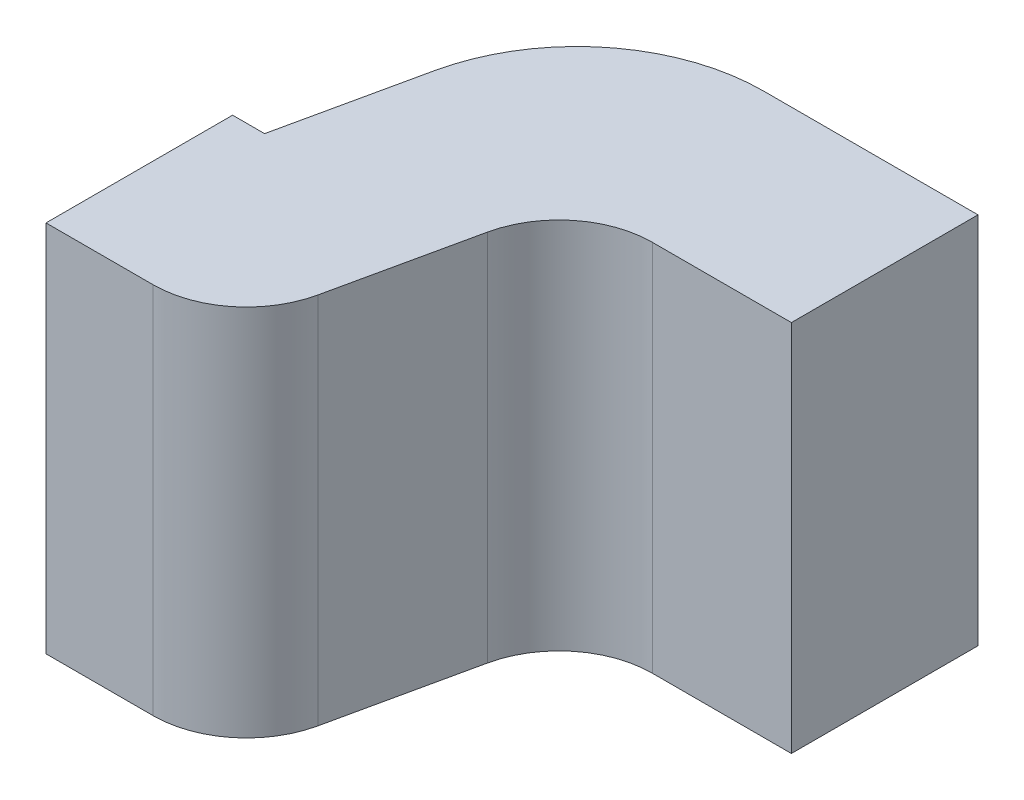
ISO-10303-21;
HEADER;
FILE_DESCRIPTION(('STEP AP214'),'2;1');
FILE_NAME('part.step','',(''),(''),'','','');
FILE_SCHEMA(('AUTOMOTIVE_DESIGN { 1 0 10303 214 1 1 1 1 }'));
ENDSEC;
DATA;
#1=APPLICATION_CONTEXT('core data for automotive mechanical design processes');
#2=APPLICATION_PROTOCOL_DEFINITION('international standard','automotive_design',2000,#1);
#3=PRODUCT_CONTEXT('',#1,'mechanical');
#4=PRODUCT('Part','Part','',(#3));
#5=PRODUCT_RELATED_PRODUCT_CATEGORY('part','',(#4));
#6=PRODUCT_DEFINITION_FORMATION('','',#4);
#7=PRODUCT_DEFINITION_CONTEXT('part definition',#1,'design');
#8=PRODUCT_DEFINITION('design','',#6,#7);
#9=PRODUCT_DEFINITION_SHAPE('','',#8);
#10=(LENGTH_UNIT() NAMED_UNIT(*) SI_UNIT(.MILLI.,.METRE.));
#11=(NAMED_UNIT(*) PLANE_ANGLE_UNIT() SI_UNIT($,.RADIAN.));
#12=(NAMED_UNIT(*) SI_UNIT($,.STERADIAN.) SOLID_ANGLE_UNIT());
#13=UNCERTAINTY_MEASURE_WITH_UNIT(LENGTH_MEASURE(1.E-05),#10,'distance_accuracy_value','');
#14=(GEOMETRIC_REPRESENTATION_CONTEXT(3) GLOBAL_UNCERTAINTY_ASSIGNED_CONTEXT((#13)) GLOBAL_UNIT_ASSIGNED_CONTEXT((#10,
#11,#12)) REPRESENTATION_CONTEXT('',''));
#15=CARTESIAN_POINT('',(0.,0.,0.));
#16=DIRECTION('',(0.,0.,1.));
#17=DIRECTION('',(1.,0.,0.));
#18=AXIS2_PLACEMENT_3D('',#15,#16,#17);
#19=CARTESIAN_POINT('',(0.76,-0.2175,0.));
#20=DIRECTION('',(0.,1.,0.));
#21=DIRECTION('',(0.,0.,1.));
#22=AXIS2_PLACEMENT_3D('',#19,#20,#21);
#23=PLANE('',#22);
#24=DIRECTION('',(1.,0.,0.));
#25=VECTOR('',#24,1.);
#26=CARTESIAN_POINT('',(0.76,-0.2175,0.2175));
#27=LINE('',#26,#25);
#28=CARTESIAN_POINT('',(1.02283563646,-0.2175,0.2175));
#29=VERTEX_POINT('',#28);
#30=CARTESIAN_POINT('',(1.185,-0.2175,0.2175));
#31=VERTEX_POINT('',#30);
#32=EDGE_CURVE('E134',#29,#31,#27,.T.);
#33=ORIENTED_EDGE('',*,*,#32,.F.);
#34=CARTESIAN_POINT('',(1.02283563646,-0.2175,0.32625));
#35=DIRECTION('',(0.,1.,0.));
#36=DIRECTION('',(0.,0.,1.));
#37=AXIS2_PLACEMENT_3D('',#34,#35,#36);
#38=CIRCLE('',#37,0.10875);
#39=CARTESIAN_POINT('',(0.916577211018419,-0.2175,0.303104600398974));
#40=VERTEX_POINT('',#39);
#41=EDGE_CURVE('E177',#29,#40,#38,.T.);
#42=ORIENTED_EDGE('',*,*,#41,.T.);
#43=DIRECTION('',(0.212831260699979,0.,-0.977088969576905));
#44=VECTOR('',#43,1.);
#45=CARTESIAN_POINT('',(0.972516850883,-0.2175,0.04629079920223));
#46=LINE('',#45,#44);
#47=CARTESIAN_POINT('',(0.881163397504583,-0.2175,0.465686198803026));
#48=VERTEX_POINT('',#47);
#49=EDGE_CURVE('E146',#48,#40,#46,.T.);
#50=ORIENTED_EDGE('',*,*,#49,.F.);
#51=CARTESIAN_POINT('',(0.774904972063,-0.2175,0.442540799202));
#52=DIRECTION('',(0.,1.,0.));
#53=DIRECTION('',(0.,0.,1.));
#54=AXIS2_PLACEMENT_3D('',#51,#52,#53);
#55=CIRCLE('',#54,0.10875);
#56=CARTESIAN_POINT('',(0.774904972063,-0.2175,0.551290799202));
#57=VERTEX_POINT('',#56);
#58=EDGE_CURVE('E150',#57,#48,#55,.T.);
#59=ORIENTED_EDGE('',*,*,#58,.F.);
#60=DIRECTION('',(1.,0.,0.));
#61=VECTOR('',#60,1.);
#62=CARTESIAN_POINT('',(0.65,-0.2175,0.551290799202));
#63=LINE('',#62,#61);
#64=CARTESIAN_POINT('',(0.65,-0.2175,0.551290799202));
#65=VERTEX_POINT('',#64);
#66=EDGE_CURVE('E151',#65,#57,#63,.T.);
#67=ORIENTED_EDGE('',*,*,#66,.F.);
#68=DIRECTION('',(0.,0.,-1.));
#69=VECTOR('',#68,1.);
#70=CARTESIAN_POINT('',(0.65,-0.2175,0.333790799202));
#71=LINE('',#70,#69);
#72=CARTESIAN_POINT('',(0.65,-0.2175,0.333790799202));
#73=VERTEX_POINT('',#72);
#74=EDGE_CURVE('E157',#65,#73,#71,.T.);
#75=ORIENTED_EDGE('',*,*,#74,.T.);
#76=DIRECTION('',(1.,0.,0.));
#77=VECTOR('',#76,1.);
#78=CARTESIAN_POINT('',(0.65,-0.2175,0.333790799202));
#79=LINE('',#78,#77);
#80=CARTESIAN_POINT('',(0.687293093243035,-0.2175,0.333790799202008));
#81=VERTEX_POINT('',#80);
#82=EDGE_CURVE('E103',#73,#81,#79,.T.);
#83=ORIENTED_EDGE('',*,*,#82,.T.);
#84=DIRECTION('',(0.212831260699979,0.,-0.977088969576905));
#85=VECTOR('',#84,1.);
#86=CARTESIAN_POINT('',(0.76,-0.2175,0.));
#87=LINE('',#86,#85);
#88=CARTESIAN_POINT('',(0.722706906756893,-0.2175,0.171209200797852));
#89=VERTEX_POINT('',#88);
#90=EDGE_CURVE('E100',#81,#89,#87,.T.);
#91=ORIENTED_EDGE('',*,*,#90,.T.);
#92=CARTESIAN_POINT('',(0.93522375764,-0.2175,0.2175));
#93=DIRECTION('',(0.,1.,0.));
#94=DIRECTION('',(0.,0.,1.));
#95=AXIS2_PLACEMENT_3D('',#92,#93,#94);
#96=CIRCLE('',#95,0.2175);
#97=CARTESIAN_POINT('',(0.93522375764,-0.2175,0.));
#98=VERTEX_POINT('',#97);
#99=EDGE_CURVE('E20',#98,#89,#96,.T.);
#100=ORIENTED_EDGE('',*,*,#99,.F.);
#101=DIRECTION('',(1.,0.,0.));
#102=VECTOR('',#101,1.);
#103=CARTESIAN_POINT('',(0.76,-0.2175,0.));
#104=LINE('',#103,#102);
#105=CARTESIAN_POINT('',(1.185,-0.2175,0.));
#106=VERTEX_POINT('',#105);
#107=EDGE_CURVE('E115',#98,#106,#104,.T.);
#108=ORIENTED_EDGE('',*,*,#107,.T.);
#109=DIRECTION('',(0.,0.,-1.));
#110=VECTOR('',#109,1.);
#111=CARTESIAN_POINT('',(1.185,-0.2175,0.));
#112=LINE('',#111,#110);
#113=EDGE_CURVE('E131',#31,#106,#112,.T.);
#114=ORIENTED_EDGE('',*,*,#113,.F.);
#115=EDGE_LOOP('',(#33,#42,#50,#59,#67,#75,#83,#91,#100,#108,#114));
#116=FACE_BOUND('',#115,.T.);
#117=ADVANCED_FACE('F17',(#116),#23,.F.);
#118=CARTESIAN_POINT('',(0.76,-0.2175,0.));
#119=DIRECTION('',(0.,0.,1.));
#120=DIRECTION('',(1.,0.,0.));
#121=AXIS2_PLACEMENT_3D('',#118,#119,#120);
#122=PLANE('',#121);
#123=DIRECTION('',(1.,0.,0.));
#124=VECTOR('',#123,1.);
#125=CARTESIAN_POINT('',(0.76,0.2175,0.));
#126=LINE('',#125,#124);
#127=CARTESIAN_POINT('',(1.185,0.2175,0.));
#128=VERTEX_POINT('',#127);
#129=CARTESIAN_POINT('',(0.93522375764,0.2175,0.));
#130=VERTEX_POINT('',#129);
#131=EDGE_CURVE('E176',#128,#130,#126,.F.);
#132=ORIENTED_EDGE('',*,*,#131,.F.);
#133=DIRECTION('',(0.,1.,0.));
#134=VECTOR('',#133,1.);
#135=CARTESIAN_POINT('',(1.185,-0.2175,0.));
#136=LINE('',#135,#134);
#137=EDGE_CURVE('E128',#106,#128,#136,.T.);
#138=ORIENTED_EDGE('',*,*,#137,.F.);
#139=ORIENTED_EDGE('',*,*,#107,.F.);
#140=DIRECTION('',(0.,1.,0.));
#141=VECTOR('',#140,1.);
#142=CARTESIAN_POINT('',(0.93522375764,-0.2175,0.));
#143=LINE('',#142,#141);
#144=EDGE_CURVE('E108',#130,#98,#143,.F.);
#145=ORIENTED_EDGE('',*,*,#144,.F.);
#146=EDGE_LOOP('',(#132,#138,#139,#145));
#147=FACE_BOUND('',#146,.T.);
#148=ADVANCED_FACE('F343',(#147),#122,.F.);
#149=CARTESIAN_POINT('',(0.93522375764,-0.2175,0.2175));
#150=DIRECTION('',(0.,1.,0.));
#151=DIRECTION('',(0.,0.,1.));
#152=AXIS2_PLACEMENT_3D('',#149,#150,#151);
#153=CYLINDRICAL_SURFACE('',#152,0.2175);
#154=CARTESIAN_POINT('',(0.93522375764,0.2175,0.2175));
#155=DIRECTION('',(0.,1.,0.));
#156=DIRECTION('',(0.,0.,1.));
#157=AXIS2_PLACEMENT_3D('',#154,#155,#156);
#158=CIRCLE('',#157,0.2175);
#159=CARTESIAN_POINT('',(0.722706906756993,0.2175,0.171209200797712));
#160=VERTEX_POINT('',#159);
#161=EDGE_CURVE('E174',#130,#160,#158,.T.);
#162=ORIENTED_EDGE('',*,*,#161,.F.);
#163=ORIENTED_EDGE('',*,*,#144,.T.);
#164=ORIENTED_EDGE('',*,*,#99,.T.);
#165=DIRECTION('',(0.,1.,0.));
#166=VECTOR('',#165,1.);
#167=CARTESIAN_POINT('',(0.722706906756867,-0.2175,0.171209200797971));
#168=LINE('',#167,#166);
#169=EDGE_CURVE('E107',#89,#160,#168,.T.);
#170=ORIENTED_EDGE('',*,*,#169,.T.);
#171=EDGE_LOOP('',(#162,#163,#164,#170));
#172=FACE_BOUND('',#171,.T.);
#173=ADVANCED_FACE('F113',(#172),#153,.T.);
#174=CARTESIAN_POINT('',(0.76,-0.2175,0.));
#175=DIRECTION('',(0.977088969576905,0.,0.212831260699979));
#176=DIRECTION('',(0.212831260699979,0.,-0.977088969576905));
#177=AXIS2_PLACEMENT_3D('',#174,#175,#176);
#178=PLANE('',#177);
#179=DIRECTION('',(-0.212831260701399,0.,0.977088969576595));
#180=VECTOR('',#179,1.);
#181=CARTESIAN_POINT('',(0.722706906757,0.2175,0.171209200798));
#182=LINE('',#181,#180);
#183=CARTESIAN_POINT('',(0.687293093243,0.2175,0.333790799202));
#184=VERTEX_POINT('',#183);
#185=EDGE_CURVE('E118',#160,#184,#182,.T.);
#186=ORIENTED_EDGE('',*,*,#185,.F.);
#187=ORIENTED_EDGE('',*,*,#169,.F.);
#188=ORIENTED_EDGE('',*,*,#90,.F.);
#189=DIRECTION('',(0.,1.,0.));
#190=VECTOR('',#189,1.);
#191=CARTESIAN_POINT('',(0.687293093243,-0.2175,0.333790799202));
#192=LINE('',#191,#190);
#193=EDGE_CURVE('E121',#81,#184,#192,.T.);
#194=ORIENTED_EDGE('',*,*,#193,.T.);
#195=EDGE_LOOP('',(#186,#187,#188,#194));
#196=FACE_BOUND('',#195,.T.);
#197=ADVANCED_FACE('F116',(#196),#178,.F.);
#198=CARTESIAN_POINT('',(0.65,-0.2175,0.333790799202));
#199=DIRECTION('',(0.,0.,1.));
#200=DIRECTION('',(1.,0.,0.));
#201=AXIS2_PLACEMENT_3D('',#198,#199,#200);
#202=PLANE('',#201);
#203=ORIENTED_EDGE('',*,*,#82,.F.);
#204=DIRECTION('',(0.,1.,0.));
#205=VECTOR('',#204,1.);
#206=CARTESIAN_POINT('',(0.65,-0.2175,0.333790799202));
#207=LINE('',#206,#205);
#208=CARTESIAN_POINT('',(0.65,0.2175,0.333790799202));
#209=VERTEX_POINT('',#208);
#210=EDGE_CURVE('E159',#73,#209,#207,.T.);
#211=ORIENTED_EDGE('',*,*,#210,.T.);
#212=DIRECTION('',(1.,0.,0.));
#213=VECTOR('',#212,1.);
#214=CARTESIAN_POINT('',(0.76,0.2175,0.333790799202));
#215=LINE('',#214,#213);
#216=EDGE_CURVE('E196',#184,#209,#215,.F.);
#217=ORIENTED_EDGE('',*,*,#216,.F.);
#218=ORIENTED_EDGE('',*,*,#193,.F.);
#219=EDGE_LOOP('',(#203,#211,#217,#218));
#220=FACE_BOUND('',#219,.T.);
#221=ADVANCED_FACE('F207',(#220),#202,.F.);
#222=CARTESIAN_POINT('',(0.65,-0.2175,0.333790799202));
#223=DIRECTION('',(1.,0.,0.));
#224=DIRECTION('',(0.,0.,-1.));
#225=AXIS2_PLACEMENT_3D('',#222,#223,#224);
#226=PLANE('',#225);
#227=DIRECTION('',(0.,1.,0.));
#228=VECTOR('',#227,1.);
#229=CARTESIAN_POINT('',(0.65,-0.2175,0.551290799202));
#230=LINE('',#229,#228);
#231=CARTESIAN_POINT('',(0.65,0.2175,0.551290799202));
#232=VERTEX_POINT('',#231);
#233=EDGE_CURVE('E154',#232,#65,#230,.F.);
#234=ORIENTED_EDGE('',*,*,#233,.F.);
#235=DIRECTION('',(0.,0.,1.));
#236=VECTOR('',#235,1.);
#237=CARTESIAN_POINT('',(0.65,0.2175,0.));
#238=LINE('',#237,#236);
#239=EDGE_CURVE('E193',#209,#232,#238,.T.);
#240=ORIENTED_EDGE('',*,*,#239,.F.);
#241=ORIENTED_EDGE('',*,*,#210,.F.);
#242=ORIENTED_EDGE('',*,*,#74,.F.);
#243=EDGE_LOOP('',(#234,#240,#241,#242));
#244=FACE_BOUND('',#243,.T.);
#245=ADVANCED_FACE('F256',(#244),#226,.F.);
#246=CARTESIAN_POINT('',(0.65,-0.2175,0.551290799202));
#247=DIRECTION('',(0.,0.,1.));
#248=DIRECTION('',(1.,0.,0.));
#249=AXIS2_PLACEMENT_3D('',#246,#247,#248);
#250=PLANE('',#249);
#251=ORIENTED_EDGE('',*,*,#66,.T.);
#252=DIRECTION('',(0.,1.,0.));
#253=VECTOR('',#252,1.);
#254=CARTESIAN_POINT('',(0.774904972063,-0.2175,0.551290799202));
#255=LINE('',#254,#253);
#256=CARTESIAN_POINT('',(0.774904972063,0.2175,0.551290799202));
#257=VERTEX_POINT('',#256);
#258=EDGE_CURVE('E153',#257,#57,#255,.F.);
#259=ORIENTED_EDGE('',*,*,#258,.F.);
#260=DIRECTION('',(1.,0.,0.));
#261=VECTOR('',#260,1.);
#262=CARTESIAN_POINT('',(0.76,0.2175,0.551290799202));
#263=LINE('',#262,#261);
#264=EDGE_CURVE('E173',#232,#257,#263,.T.);
#265=ORIENTED_EDGE('',*,*,#264,.F.);
#266=ORIENTED_EDGE('',*,*,#233,.T.);
#267=EDGE_LOOP('',(#251,#259,#265,#266));
#268=FACE_BOUND('',#267,.T.);
#269=ADVANCED_FACE('F245',(#268),#250,.T.);
#270=CARTESIAN_POINT('',(0.774904972063,-0.2175,0.442540799202));
#271=DIRECTION('',(0.,1.,0.));
#272=DIRECTION('',(0.,0.,1.));
#273=AXIS2_PLACEMENT_3D('',#270,#271,#272);
#274=CYLINDRICAL_SURFACE('',#273,0.10875);
#275=ORIENTED_EDGE('',*,*,#258,.T.);
#276=ORIENTED_EDGE('',*,*,#58,.T.);
#277=DIRECTION('',(0.,1.,0.));
#278=VECTOR('',#277,1.);
#279=CARTESIAN_POINT('',(0.881163397504608,-0.2175,0.465686198802915));
#280=LINE('',#279,#278);
#281=CARTESIAN_POINT('',(0.881163397504831,0.2175,0.465686198802834));
#282=VERTEX_POINT('',#281);
#283=EDGE_CURVE('E149',#282,#48,#280,.F.);
#284=ORIENTED_EDGE('',*,*,#283,.F.);
#285=CARTESIAN_POINT('',(0.774904972063,0.2175,0.442540799202));
#286=DIRECTION('',(0.,1.,0.));
#287=DIRECTION('',(0.,0.,1.));
#288=AXIS2_PLACEMENT_3D('',#285,#286,#287);
#289=CIRCLE('',#288,0.10875);
#290=EDGE_CURVE('E170',#257,#282,#289,.T.);
#291=ORIENTED_EDGE('',*,*,#290,.F.);
#292=EDGE_LOOP('',(#275,#276,#284,#291));
#293=FACE_BOUND('',#292,.T.);
#294=ADVANCED_FACE('F247',(#293),#274,.T.);
#295=CARTESIAN_POINT('',(0.972516850883,-0.2175,0.04629079920223));
#296=DIRECTION('',(0.977088969576905,0.,0.212831260699979));
#297=DIRECTION('',(0.212831260699979,0.,-0.977088969576905));
#298=AXIS2_PLACEMENT_3D('',#295,#296,#297);
#299=PLANE('',#298);
#300=DIRECTION('',(0.212831260695663,0.,-0.977088969577845));
#301=VECTOR('',#300,1.);
#302=CARTESIAN_POINT('',(0.881163397505,0.2175,0.465686198803));
#303=LINE('',#302,#301);
#304=CARTESIAN_POINT('',(0.916577211018205,0.2175,0.303104600399173));
#305=VERTEX_POINT('',#304);
#306=EDGE_CURVE('E169',#282,#305,#303,.T.);
#307=ORIENTED_EDGE('',*,*,#306,.F.);
#308=ORIENTED_EDGE('',*,*,#283,.T.);
#309=ORIENTED_EDGE('',*,*,#49,.T.);
#310=DIRECTION('',(0.,1.,0.));
#311=VECTOR('',#310,1.);
#312=CARTESIAN_POINT('',(0.916577211018463,-0.2175,0.303104600399101));
#313=LINE('',#312,#311);
#314=EDGE_CURVE('E178',#40,#305,#313,.T.);
#315=ORIENTED_EDGE('',*,*,#314,.T.);
#316=EDGE_LOOP('',(#307,#308,#309,#315));
#317=FACE_BOUND('',#316,.T.);
#318=ADVANCED_FACE('F234',(#317),#299,.T.);
#319=CARTESIAN_POINT('',(1.02283563646,-0.2175,0.32625));
#320=DIRECTION('',(0.,1.,0.));
#321=DIRECTION('',(0.,0.,1.));
#322=AXIS2_PLACEMENT_3D('',#319,#320,#321);
#323=CYLINDRICAL_SURFACE('',#322,0.10875);
#324=CARTESIAN_POINT('',(1.02283563646,0.2175,0.32625));
#325=DIRECTION('',(0.,1.,0.));
#326=DIRECTION('',(0.,0.,1.));
#327=AXIS2_PLACEMENT_3D('',#324,#325,#326);
#328=CIRCLE('',#327,0.10875);
#329=CARTESIAN_POINT('',(1.02283563646,0.2175,0.2175));
#330=VERTEX_POINT('',#329);
#331=EDGE_CURVE('E166',#305,#330,#328,.F.);
#332=ORIENTED_EDGE('',*,*,#331,.F.);
#333=ORIENTED_EDGE('',*,*,#314,.F.);
#334=ORIENTED_EDGE('',*,*,#41,.F.);
#335=DIRECTION('',(0.,1.,0.));
#336=VECTOR('',#335,1.);
#337=CARTESIAN_POINT('',(1.02283563646,-0.2175,0.2175));
#338=LINE('',#337,#336);
#339=EDGE_CURVE('E136',#330,#29,#338,.F.);
#340=ORIENTED_EDGE('',*,*,#339,.F.);
#341=EDGE_LOOP('',(#332,#333,#334,#340));
#342=FACE_BOUND('',#341,.T.);
#343=ADVANCED_FACE('F237',(#342),#323,.F.);
#344=CARTESIAN_POINT('',(0.76,-0.2175,0.2175));
#345=DIRECTION('',(0.,0.,1.));
#346=DIRECTION('',(1.,0.,0.));
#347=AXIS2_PLACEMENT_3D('',#344,#345,#346);
#348=PLANE('',#347);
#349=ORIENTED_EDGE('',*,*,#32,.T.);
#350=DIRECTION('',(0.,1.,0.));
#351=VECTOR('',#350,1.);
#352=CARTESIAN_POINT('',(1.185,-0.2175,0.2175));
#353=LINE('',#352,#351);
#354=CARTESIAN_POINT('',(1.185,0.2175,0.2175));
#355=VERTEX_POINT('',#354);
#356=EDGE_CURVE('E35',#355,#31,#353,.F.);
#357=ORIENTED_EDGE('',*,*,#356,.F.);
#358=DIRECTION('',(1.,0.,0.));
#359=VECTOR('',#358,1.);
#360=CARTESIAN_POINT('',(0.76,0.2175,0.2175));
#361=LINE('',#360,#359);
#362=EDGE_CURVE('E26',#330,#355,#361,.T.);
#363=ORIENTED_EDGE('',*,*,#362,.F.);
#364=ORIENTED_EDGE('',*,*,#339,.T.);
#365=EDGE_LOOP('',(#349,#357,#363,#364));
#366=FACE_BOUND('',#365,.T.);
#367=ADVANCED_FACE('F264',(#366),#348,.T.);
#368=CARTESIAN_POINT('',(1.185,-0.2175,0.));
#369=DIRECTION('',(1.,0.,0.));
#370=DIRECTION('',(0.,0.,-1.));
#371=AXIS2_PLACEMENT_3D('',#368,#369,#370);
#372=PLANE('',#371);
#373=DIRECTION('',(0.,0.,1.));
#374=VECTOR('',#373,1.);
#375=CARTESIAN_POINT('',(1.185,0.2175,0.));
#376=LINE('',#375,#374);
#377=EDGE_CURVE('E11',#355,#128,#376,.F.);
#378=ORIENTED_EDGE('',*,*,#377,.F.);
#379=ORIENTED_EDGE('',*,*,#356,.T.);
#380=ORIENTED_EDGE('',*,*,#113,.T.);
#381=ORIENTED_EDGE('',*,*,#137,.T.);
#382=EDGE_LOOP('',(#378,#379,#380,#381));
#383=FACE_BOUND('',#382,.T.);
#384=ADVANCED_FACE('F259',(#383),#372,.T.);
#385=CARTESIAN_POINT('',(0.76,0.2175,0.));
#386=DIRECTION('',(0.,1.,0.));
#387=DIRECTION('',(0.,0.,1.));
#388=AXIS2_PLACEMENT_3D('',#385,#386,#387);
#389=PLANE('',#388);
#390=ORIENTED_EDGE('',*,*,#362,.T.);
#391=ORIENTED_EDGE('',*,*,#377,.T.);
#392=ORIENTED_EDGE('',*,*,#131,.T.);
#393=ORIENTED_EDGE('',*,*,#161,.T.);
#394=ORIENTED_EDGE('',*,*,#185,.T.);
#395=ORIENTED_EDGE('',*,*,#216,.T.);
#396=ORIENTED_EDGE('',*,*,#239,.T.);
#397=ORIENTED_EDGE('',*,*,#264,.T.);
#398=ORIENTED_EDGE('',*,*,#290,.T.);
#399=ORIENTED_EDGE('',*,*,#306,.T.);
#400=ORIENTED_EDGE('',*,*,#331,.T.);
#401=EDGE_LOOP('',(#390,#391,#392,#393,#394,#395,#396,#397,#398,#399,#400));
#402=FACE_BOUND('',#401,.T.);
#403=ADVANCED_FACE('F212',(#402),#389,.T.);
#404=CLOSED_SHELL('',(#117,#148,#173,#197,#221,#245,#269,#294,#318,#343,#367,#384,#403));
#405=MANIFOLD_SOLID_BREP('B1',#404);
#406=ADVANCED_BREP_SHAPE_REPRESENTATION('',(#18,#405),#14);
#407=SHAPE_DEFINITION_REPRESENTATION(#9,#406);
ENDSEC;
END-ISO-10303-21;
